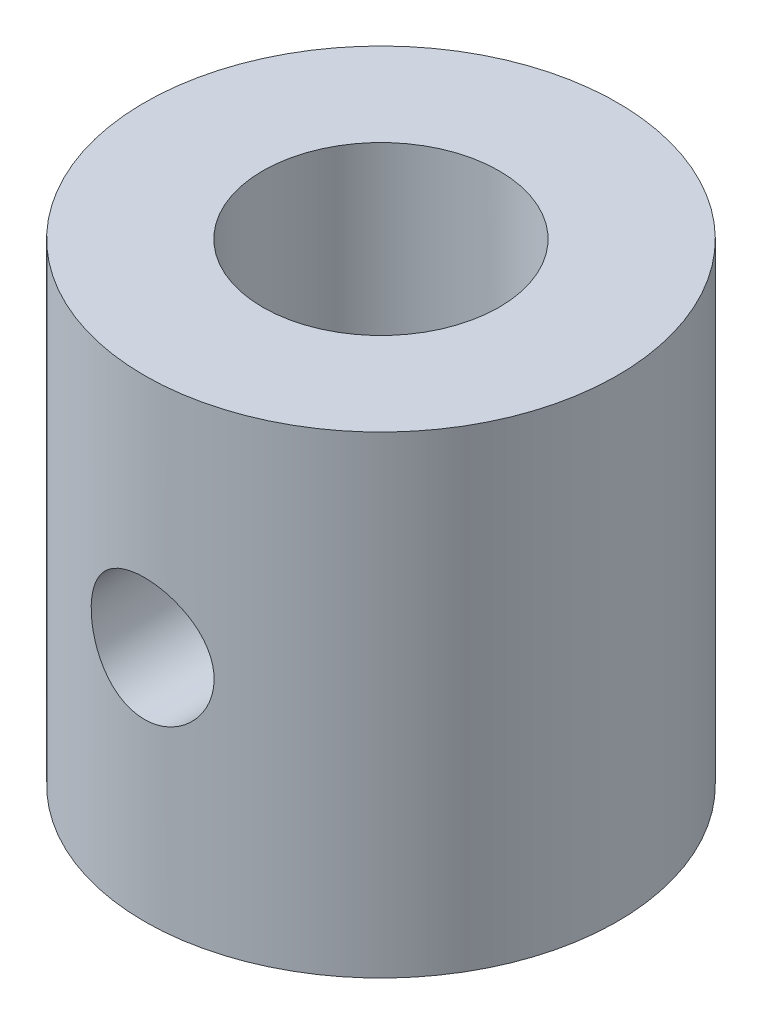
ISO-10303-21;
HEADER;
FILE_DESCRIPTION(('STEP AP214'),'2;1');
FILE_NAME('part.step','',(''),(''),'','','');
FILE_SCHEMA(('AUTOMOTIVE_DESIGN { 1 0 10303 214 1 1 1 1 }'));
ENDSEC;
DATA;
#1=APPLICATION_CONTEXT('core data for automotive mechanical design processes');
#2=APPLICATION_PROTOCOL_DEFINITION('international standard','automotive_design',2000,#1);
#3=PRODUCT_CONTEXT('',#1,'mechanical');
#4=PRODUCT('Part','Part','',(#3));
#5=PRODUCT_RELATED_PRODUCT_CATEGORY('part','',(#4));
#6=PRODUCT_DEFINITION_FORMATION('','',#4);
#7=PRODUCT_DEFINITION_CONTEXT('part definition',#1,'design');
#8=PRODUCT_DEFINITION('design','',#6,#7);
#9=PRODUCT_DEFINITION_SHAPE('','',#8);
#10=(LENGTH_UNIT() NAMED_UNIT(*) SI_UNIT(.MILLI.,.METRE.));
#11=(NAMED_UNIT(*) PLANE_ANGLE_UNIT() SI_UNIT($,.RADIAN.));
#12=(NAMED_UNIT(*) SI_UNIT($,.STERADIAN.) SOLID_ANGLE_UNIT());
#13=UNCERTAINTY_MEASURE_WITH_UNIT(LENGTH_MEASURE(1.E-05),#10,'distance_accuracy_value','');
#14=(GEOMETRIC_REPRESENTATION_CONTEXT(3) GLOBAL_UNCERTAINTY_ASSIGNED_CONTEXT((#13)) GLOBAL_UNIT_ASSIGNED_CONTEXT((#10,
#11,#12)) REPRESENTATION_CONTEXT('',''));
#15=CARTESIAN_POINT('',(0.,0.,0.));
#16=DIRECTION('',(0.,0.,1.));
#17=DIRECTION('',(1.,0.,0.));
#18=AXIS2_PLACEMENT_3D('',#15,#16,#17);
#19=CARTESIAN_POINT('',(0.,10.,0.));
#20=DIRECTION('',(0.,1.,0.));
#21=DIRECTION('',(0.,0.,1.));
#22=AXIS2_PLACEMENT_3D('',#19,#20,#21);
#23=PLANE('',#22);
#24=CARTESIAN_POINT('',(0.,10.,0.));
#25=DIRECTION('',(0.,1.,0.));
#26=DIRECTION('',(0.,0.,1.));
#27=AXIS2_PLACEMENT_3D('',#24,#25,#26);
#28=CIRCLE('',#27,5.);
#29=CARTESIAN_POINT('',(0.,10.,5.));
#30=VERTEX_POINT('',#29);
#31=EDGE_CURVE('E49',#30,#30,#28,.T.);
#32=ORIENTED_EDGE('',*,*,#31,.T.);
#33=EDGE_LOOP('',(#32));
#34=FACE_BOUND('',#33,.T.);
#35=CARTESIAN_POINT('',(0.,10.,0.));
#36=DIRECTION('',(0.,1.,0.));
#37=DIRECTION('',(0.,0.,1.));
#38=AXIS2_PLACEMENT_3D('',#35,#36,#37);
#39=CIRCLE('',#38,2.5);
#40=CARTESIAN_POINT('',(0.,10.,2.5));
#41=VERTEX_POINT('',#40);
#42=EDGE_CURVE('E85',#41,#41,#39,.T.);
#43=ORIENTED_EDGE('',*,*,#42,.F.);
#44=EDGE_LOOP('',(#43));
#45=FACE_BOUND('',#44,.T.);
#46=ADVANCED_FACE('F33',(#34,#45),#23,.T.);
#47=CARTESIAN_POINT('',(0.,0.,0.));
#48=DIRECTION('',(0.,1.,0.));
#49=DIRECTION('',(0.,0.,1.));
#50=AXIS2_PLACEMENT_3D('',#47,#48,#49);
#51=PLANE('',#50);
#52=CARTESIAN_POINT('',(0.,0.,0.));
#53=DIRECTION('',(0.,1.,0.));
#54=DIRECTION('',(0.,0.,1.));
#55=AXIS2_PLACEMENT_3D('',#52,#53,#54);
#56=CIRCLE('',#55,5.);
#57=CARTESIAN_POINT('',(0.,0.,5.));
#58=VERTEX_POINT('',#57);
#59=EDGE_CURVE('E53',#58,#58,#56,.T.);
#60=ORIENTED_EDGE('',*,*,#59,.F.);
#61=EDGE_LOOP('',(#60));
#62=FACE_BOUND('',#61,.T.);
#63=CARTESIAN_POINT('',(0.,0.,0.));
#64=DIRECTION('',(0.,1.,0.));
#65=DIRECTION('',(0.,0.,1.));
#66=AXIS2_PLACEMENT_3D('',#63,#64,#65);
#67=CIRCLE('',#66,2.5);
#68=CARTESIAN_POINT('',(0.,0.,2.5));
#69=VERTEX_POINT('',#68);
#70=EDGE_CURVE('E84',#69,#69,#67,.T.);
#71=ORIENTED_EDGE('',*,*,#70,.T.);
#72=EDGE_LOOP('',(#71));
#73=FACE_BOUND('',#72,.T.);
#74=ADVANCED_FACE('F91',(#62,#73),#51,.F.);
#75=CARTESIAN_POINT('',(0.,10.,0.));
#76=DIRECTION('',(0.,-1.,0.));
#77=DIRECTION('',(0.,0.,-1.));
#78=AXIS2_PLACEMENT_3D('',#75,#76,#77);
#79=CYLINDRICAL_SURFACE('',#78,5.);
#80=CARTESIAN_POINT('',(0.,6.3,-5.));
#81=CARTESIAN_POINT('',(-0.0717307786716104,6.29999816586154,-4.99999885912454));
#82=CARTESIAN_POINT('',(-0.14348153894728,6.29404317706765,-4.998441140995));
#83=CARTESIAN_POINT('',(-0.284920413497906,6.2704200751648,-4.99237823364743));
#84=CARTESIAN_POINT('',(-0.354607444099346,6.25274591833175,-4.98787152361252));
#85=CARTESIAN_POINT('',(-0.489856453463625,6.20629469406177,-4.97640871761101));
#86=CARTESIAN_POINT('',(-0.555423483742324,6.1775315444106,-4.96945569296409));
#87=CARTESIAN_POINT('',(-0.68080247992251,6.10976934681149,-4.95383737776702));
#88=CARTESIAN_POINT('',(-0.740614138181473,6.07076975210864,-4.94517199576156));
#89=CARTESIAN_POINT('',(-0.854108529262041,5.98273009067953,-4.92685216626645));
#90=CARTESIAN_POINT('',(-0.907645708599976,5.93350576070611,-4.91718147538334));
#91=CARTESIAN_POINT('',(-1.0058054182008,5.82680807084766,-4.89804673326225));
#92=CARTESIAN_POINT('',(-1.05042685981889,5.76933370507305,-4.88858270738436));
#93=CARTESIAN_POINT('',(-1.13018788316099,5.64661851125556,-4.87076767855598));
#94=CARTESIAN_POINT('',(-1.16516190324781,5.58126681773134,-4.86243722215411));
#95=CARTESIAN_POINT('',(-1.22356960439173,5.44535959205325,-4.84807058079245));
#96=CARTESIAN_POINT('',(-1.24700529718818,5.37480496951268,-4.84203399593172));
#97=CARTESIAN_POINT('',(-1.281169228899,5.23210205052739,-4.83310598130334));
#98=CARTESIAN_POINT('',(-1.29216048290362,5.16002088452016,-4.83014956376373));
#99=CARTESIAN_POINT('',(-1.3019432296733,5.01498176997082,-4.82752230668979));
#100=CARTESIAN_POINT('',(-1.30073688084738,4.94202397883275,-4.82785088586354));
#101=CARTESIAN_POINT('',(-1.2863678960504,4.79934028716682,-4.83169822957429));
#102=CARTESIAN_POINT('',(-1.2735215273875,4.72957990208878,-4.83513260277125));
#103=CARTESIAN_POINT('',(-1.23674288104121,4.59324021046968,-4.84466969943908));
#104=CARTESIAN_POINT('',(-1.21280975642707,4.52666114738238,-4.85077262676204));
#105=CARTESIAN_POINT('',(-1.15427447680391,4.39774002853323,-4.86503471141451));
#106=CARTESIAN_POINT('',(-1.11955986166448,4.33545151285766,-4.87321536914182));
#107=CARTESIAN_POINT('',(-1.04052555441476,4.21747178012729,-4.89069936804917));
#108=CARTESIAN_POINT('',(-0.996204056417374,4.16178180650457,-4.90000292016326));
#109=CARTESIAN_POINT('',(-0.897588399354157,4.0567707801978,-4.9190373655284));
#110=CARTESIAN_POINT('',(-0.843028117151477,4.00770008928812,-4.92877257463288));
#111=CARTESIAN_POINT('',(-0.726334791666221,3.91935513083208,-4.947314710364));
#112=CARTESIAN_POINT('',(-0.664201478488646,3.88008121258463,-4.95612160388557));
#113=CARTESIAN_POINT('',(-0.533750553018984,3.81234191921762,-4.97186464472852));
#114=CARTESIAN_POINT('',(-0.465409427094991,3.78391995820683,-4.978793246417));
#115=CARTESIAN_POINT('',(-0.324698261892371,3.73903950096387,-4.98994437896931));
#116=CARTESIAN_POINT('',(-0.252329061519939,3.72257852364206,-4.99416747102063));
#117=CARTESIAN_POINT('',(-0.107754265628856,3.70247601810568,-4.99934762845146));
#118=CARTESIAN_POINT('',(-0.0355990679618566,3.69849388039378,-5.00039144909205));
#119=CARTESIAN_POINT('',(0.108347558385988,3.70252407708697,-4.9993439302767));
#120=CARTESIAN_POINT('',(0.180139021986154,3.71053523734338,-4.99725289772412));
#121=CARTESIAN_POINT('',(0.320117661841459,3.73804465756627,-4.9902264842307));
#122=CARTESIAN_POINT('',(0.3883443967086,3.75735463113079,-4.98533775354441));
#123=CARTESIAN_POINT('',(0.520584855265785,3.80669635149957,-4.97326895706077));
#124=CARTESIAN_POINT('',(0.584598133561371,3.83672922964772,-4.96608864949399));
#125=CARTESIAN_POINT('',(0.707930992016775,3.90730750951055,-4.95002802767655));
#126=CARTESIAN_POINT('',(0.767139321552232,3.94804043928579,-4.94111821378144));
#127=CARTESIAN_POINT('',(0.878000441471827,4.03862522166252,-4.92262930746647));
#128=CARTESIAN_POINT('',(0.929651812778711,4.08847878302904,-4.91305008984093));
#129=CARTESIAN_POINT('',(1.02535533145664,4.19747610283433,-4.89398559724572));
#130=CARTESIAN_POINT('',(1.0691676974822,4.25683240802754,-4.88450966299983));
#131=CARTESIAN_POINT('',(1.14621298401497,4.38225303325104,-4.86700757475785));
#132=CARTESIAN_POINT('',(1.1794463607291,4.44831706385618,-4.85898135825078));
#133=CARTESIAN_POINT('',(1.23414034237999,4.58493610486184,-4.84537844502717));
#134=CARTESIAN_POINT('',(1.25567007103908,4.65546193804776,-4.83978740561989));
#135=CARTESIAN_POINT('',(1.28651743722663,4.79930171484937,-4.83168004742566));
#136=CARTESIAN_POINT('',(1.29583800946139,4.87261498408958,-4.82916298975775));
#137=CARTESIAN_POINT('',(1.30183988013393,5.01749983369733,-4.82754813134566));
#138=CARTESIAN_POINT('',(1.29890566929442,5.08905457201614,-4.82834631145179));
#139=CARTESIAN_POINT('',(1.28136829919157,5.2306112653395,-4.83302969132189));
#140=CARTESIAN_POINT('',(1.26676541261453,5.30061325659105,-4.83691481894669));
#141=CARTESIAN_POINT('',(1.22652296626336,5.43662027692297,-4.84727400349191));
#142=CARTESIAN_POINT('',(1.20096107281371,5.5026497724797,-4.85372981947422));
#143=CARTESIAN_POINT('',(1.13958690119683,5.62953183040472,-4.86850424398437));
#144=CARTESIAN_POINT('',(1.10377308914157,5.6903836163174,-4.87682313122364));
#145=CARTESIAN_POINT('',(1.02173013022611,5.8070274672692,-4.89467814244602));
#146=CARTESIAN_POINT('',(0.97523679892822,5.86262951434169,-4.9042418835856));
#147=CARTESIAN_POINT('',(0.87366206477925,5.96536747478793,-4.92335054739323));
#148=CARTESIAN_POINT('',(0.818578597936101,6.01250134760105,-4.93289546497886));
#149=CARTESIAN_POINT('',(0.700055598942871,6.09789014611913,-4.95111947868785));
#150=CARTESIAN_POINT('',(0.636470787048337,6.13594830359197,-4.9597774014975));
#151=CARTESIAN_POINT('',(0.50358410149903,6.20077479935966,-4.97502379799896));
#152=CARTESIAN_POINT('',(0.434286110017086,6.22755072968078,-4.9816136625622));
#153=CARTESIAN_POINT('',(0.304324490623244,6.26536273677146,-4.99107925028337));
#154=CARTESIAN_POINT('',(0.244245830872914,6.27832240703174,-4.99440072931575));
#155=CARTESIAN_POINT('',(0.122782916586036,6.29564144249486,-4.99886149574191));
#156=CARTESIAN_POINT('',(0.0613987782532482,6.30000156995174,-5.00000097654536));
#157=CARTESIAN_POINT('',(0.,6.3,-5.));
#158=B_SPLINE_CURVE_WITH_KNOTS('',3,(#80,#81,#82,#83,#84,#85,#86,#87,#88,#89,#90,#91,#92,#93,
#94,#95,#96,#97,#98,#99,#100,#101,#102,#103,#104,#105,#106,#107,#108,#109,#110,#111,#112,#113,
#114,#115,#116,#117,#118,#119,#120,#121,#122,#123,#124,#125,#126,#127,#128,#129,#130,#131,#132,
#133,#134,#135,#136,#137,#138,#139,#140,#141,#142,#143,#144,#145,#146,#147,#148,#149,#150,#151,
#152,#153,#154,#155,#156,#157),.UNSPECIFIED.,.T.,.F.,(4,2,2,2,2,2,2,2,2,2,2,2,2,2,2,2,2,2,2,2,2,
2,2,2,2,2,2,2,2,2,2,2,2,2,2,2,2,2,4),(0.,0.214967237033415,0.43004542172036,0.644854536178949,
0.859675126481417,1.07876816860036,1.29788794646979,1.52056237814132,1.74319797214783,
1.96103475933145,2.17883300019886,2.39088534386669,2.60295388914234,2.8173133212086,
3.03171308323144,3.25274629224052,3.47378738094936,3.69570372080879,3.91757401498792,
4.13333313105578,4.34907112560077,4.56131245775761,4.77357618952829,4.98984196043498,
5.20614829065226,5.42823125959202,5.65030465015768,5.87105177957784,6.09174583842406,
6.30556854774109,6.51938626036272,6.73171306829716,6.94407166110446,7.16239228611877,
7.38076544910421,7.60351288552391,7.82611019062644,8.01013016140658,8.19413382012542),.UNSPECIFIED.);
#159=CARTESIAN_POINT('',(0.,6.3,-5.));
#160=VERTEX_POINT('',#159);
#161=EDGE_CURVE('E10',#160,#160,#158,.T.);
#162=ORIENTED_EDGE('',*,*,#161,.T.);
#163=EDGE_LOOP('',(#162));
#164=FACE_BOUND('',#163,.T.);
#165=CARTESIAN_POINT('',(1.3,5.,4.82804308182932));
#166=CARTESIAN_POINT('',(1.29999814071176,4.92831543819353,4.82804438294673));
#167=CARTESIAN_POINT('',(1.29405055878907,4.85661084443446,4.82965703633706));
#168=CARTESIAN_POINT('',(1.27045953916153,4.71526772094445,4.83591526705558));
#169=CARTESIAN_POINT('',(1.25280985374835,4.6456303156384,4.84056246449516));
#170=CARTESIAN_POINT('',(1.20643013528902,4.51048658520935,4.85232867742722));
#171=CARTESIAN_POINT('',(1.17771516047257,4.44497478609409,4.85944433240521));
#172=CARTESIAN_POINT('',(1.11006663109088,4.31968943993345,4.87534146258583));
#173=CARTESIAN_POINT('',(1.07113242774976,4.25991625753791,4.88412304354127));
#174=CARTESIAN_POINT('',(0.983160787049072,4.14638311257075,4.9025965333159));
#175=CARTESIAN_POINT('',(0.933924358385022,4.09277982933261,4.91230394030119));
#176=CARTESIAN_POINT('',(0.827174138302681,3.9944912078773,4.93140126074018));
#177=CARTESIAN_POINT('',(0.76965952476481,3.94980675645658,4.94079114254542));
#178=CARTESIAN_POINT('',(0.646904444191931,3.86997589459211,4.9583677715965));
#179=CARTESIAN_POINT('',(0.581559990615817,3.83498449788117,4.96653410115342));
#180=CARTESIAN_POINT('',(0.445668225158111,3.77654272784076,4.98056608916578));
#181=CARTESIAN_POINT('',(0.375121747806653,3.75309050796047,4.98643211569552));
#182=CARTESIAN_POINT('',(0.232463096599407,3.71889776742967,4.99509297894462));
#183=CARTESIAN_POINT('',(0.160418728433336,3.70789090717153,4.99795206894796));
#184=CARTESIAN_POINT('',(0.0154531003528707,3.69806416253083,5.00050126649153));
#185=CARTESIAN_POINT('',(-0.0574680179168839,3.69924233531538,5.00019187922718));
#186=CARTESIAN_POINT('',(-0.20026604954253,3.71356302571352,4.99648636625984));
#187=CARTESIAN_POINT('',(-0.270174027946926,3.72641789731932,4.99316445484447));
#188=CARTESIAN_POINT('',(-0.406804325801316,3.76326333633406,4.9838942454672));
#189=CARTESIAN_POINT('',(-0.47352646805391,3.78725452235512,4.97794580160471));
#190=CARTESIAN_POINT('',(-0.602634963507835,3.84591699919819,4.96397941622098));
#191=CARTESIAN_POINT('',(-0.664973662956062,3.8806883915405,4.95594219714625));
#192=CARTESIAN_POINT('',(-0.783030487328476,3.95984779039856,4.93866663714116));
#193=CARTESIAN_POINT('',(-0.838747374530537,4.00423759038396,4.92942807233384));
#194=CARTESIAN_POINT('',(-0.943695381212287,4.1029068745289,4.9104347530293));
#195=CARTESIAN_POINT('',(-0.992689398894569,4.15743744694639,4.90067280347285));
#196=CARTESIAN_POINT('',(-1.08089314371402,4.27404241005206,4.88197793346539));
#197=CARTESIAN_POINT('',(-1.12010233345944,4.33611721479812,4.87304505856484));
#198=CARTESIAN_POINT('',(-1.18779210748277,4.46654264941231,4.85699211258632));
#199=CARTESIAN_POINT('',(-1.21621126282147,4.53492653676509,4.84988249375313));
#200=CARTESIAN_POINT('',(-1.2610735265125,4.67573191871052,4.83841251034588));
#201=CARTESIAN_POINT('',(-1.27751943723864,4.74815246423648,4.8340515024833));
#202=CARTESIAN_POINT('',(-1.29756590475638,4.89276552402976,4.82870874086795));
#203=CARTESIAN_POINT('',(-1.30151887902437,4.96490581733837,4.82763430392206));
#204=CARTESIAN_POINT('',(-1.29743573427148,5.10881608059619,4.82873328148061));
#205=CARTESIAN_POINT('',(-1.28940082017096,5.18058608703593,4.83090636957155));
#206=CARTESIAN_POINT('',(-1.26187999435491,5.32038079373405,4.83816630770043));
#207=CARTESIAN_POINT('',(-1.24260320473063,5.38844969559454,4.84319990379352));
#208=CARTESIAN_POINT('',(-1.19337962137627,5.52038894317616,4.85556226857613));
#209=CARTESIAN_POINT('',(-1.16343148592986,5.58425875974648,4.8628913258617));
#210=CARTESIAN_POINT('',(-1.09299086940367,5.7074689000758,4.87921104043398));
#211=CARTESIAN_POINT('',(-1.05228991050067,5.76668574081089,4.8882333961873));
#212=CARTESIAN_POINT('',(-0.961759519956489,5.87757849959682,4.90684725131463));
#213=CARTESIAN_POINT('',(-0.911928460286918,5.9292530697951,4.91643885198665));
#214=CARTESIAN_POINT('',(-0.802927457642495,6.02504294767372,4.93542752332724));
#215=CARTESIAN_POINT('',(-0.743539647922228,6.06891329051749,4.94481212896065));
#216=CARTESIAN_POINT('',(-0.618036999439785,6.14606053178623,4.9620596797932));
#217=CARTESIAN_POINT('',(-0.551922517385504,6.17933799155394,4.9699227056159));
#218=CARTESIAN_POINT('',(-0.41530676124558,6.23405543853372,4.98319077006388));
#219=CARTESIAN_POINT('',(-0.344842287213748,6.25558271455981,4.98861387964561));
#220=CARTESIAN_POINT('',(-0.201134819664027,6.28644580609914,4.99647044658465));
#221=CARTESIAN_POINT('',(-0.127892412625103,6.2957841803595,4.99890453140465));
#222=CARTESIAN_POINT('',(0.0169981653282687,6.30185070607764,5.00048079571631));
#223=CARTESIAN_POINT('',(0.0886304510901346,6.29893905729201,4.99971700870091));
#224=CARTESIAN_POINT('',(0.230348414653652,6.28141992611172,4.99519432073835));
#225=CARTESIAN_POINT('',(0.300434145402538,6.26681284475751,4.99143552249119));
#226=CARTESIAN_POINT('',(0.43665906629316,6.2265170125288,4.98136216530199));
#227=CARTESIAN_POINT('',(0.502820193629004,6.2008981258412,4.97506373435513));
#228=CARTESIAN_POINT('',(0.629942643035346,6.13936860176776,4.96057154267878));
#229=CARTESIAN_POINT('',(0.690903263203756,6.10345657798047,4.95237752665817));
#230=CARTESIAN_POINT('',(0.80758395880246,6.02128794622585,4.93471195701911));
#231=CARTESIAN_POINT('',(0.863130097729761,5.97479022781909,4.92521308618471));
#232=CARTESIAN_POINT('',(0.965753327538054,5.87323180056746,4.90612382290124));
#233=CARTESIAN_POINT('',(1.0128282208609,5.81816887667688,4.89653340738171));
#234=CARTESIAN_POINT('',(1.09813020007219,5.69967721251508,4.87812032233053));
#235=CARTESIAN_POINT('',(1.13615490974272,5.63609942681561,4.8693175526745));
#236=CARTESIAN_POINT('',(1.20092064597112,5.50323277055425,4.85375181162252));
#237=CARTESIAN_POINT('',(1.22766939505212,5.43394784761835,4.84698744510167));
#238=CARTESIAN_POINT('',(1.26542522449605,5.30405187769319,4.83725203116222));
#239=CARTESIAN_POINT('',(1.27836122683162,5.24402856715327,4.83382580755705));
#240=CARTESIAN_POINT('',(1.29564897409146,5.12267497210455,4.82922089033318));
#241=CARTESIAN_POINT('',(1.30000159110555,5.06134482101356,4.82804196838435));
#242=CARTESIAN_POINT('',(1.3,5.,4.82804308182932));
#243=B_SPLINE_CURVE_WITH_KNOTS('',3,(#165,#166,#167,#168,#169,#170,#171,#172,#173,#174,#175,
#176,#177,#178,#179,#180,#181,#182,#183,#184,#185,#186,#187,#188,#189,#190,#191,#192,#193,#194,
#195,#196,#197,#198,#199,#200,#201,#202,#203,#204,#205,#206,#207,#208,#209,#210,#211,#212,#213,
#214,#215,#216,#217,#218,#219,#220,#221,#222,#223,#224,#225,#226,#227,#228,#229,#230,#231,#232,
#233,#234,#235,#236,#237,#238,#239,#240,#241,#242),.UNSPECIFIED.,.T.,.F.,(4,2,2,2,2,2,2,2,2,2,2,
2,2,2,2,2,2,2,2,2,2,2,2,2,2,2,2,2,2,2,2,2,2,2,2,2,2,2,4),(0.,0.214828234146462,
0.429771256724355,0.64442280062493,0.859087975147308,1.07836257149293,1.29765895938899,
1.52028284784706,1.74287109943657,1.96059988111388,2.17829394773421,2.3907665602754,
2.60325097688922,2.81777074350615,3.0323305444295,3.253160137729,3.47400185652499,
3.6960826450123,3.91811143810026,4.13381831947844,4.34950352129991,4.56129902598918,
4.77312116928793,4.98939736474058,5.20571216295111,5.42793411443678,5.65014428787732,
5.87068044429091,6.09117029734818,6.30522287884536,6.51926812071938,6.73197494966035,
6.94471044194736,7.16288757110522,7.38112121709,7.60385320075513,7.82643239403149,
8.01029260630719,8.19413413703944),.UNSPECIFIED.);
#244=CARTESIAN_POINT('',(1.3,5.,4.82804308182932));
#245=VERTEX_POINT('',#244);
#246=EDGE_CURVE('E45',#245,#245,#243,.T.);
#247=ORIENTED_EDGE('',*,*,#246,.T.);
#248=EDGE_LOOP('',(#247));
#249=FACE_BOUND('',#248,.T.);
#250=ORIENTED_EDGE('',*,*,#31,.F.);
#251=EDGE_LOOP('',(#250));
#252=FACE_BOUND('',#251,.T.);
#253=ORIENTED_EDGE('',*,*,#59,.T.);
#254=EDGE_LOOP('',(#253));
#255=FACE_BOUND('',#254,.T.);
#256=ADVANCED_FACE('F35',(#164,#249,#252,#255),#79,.T.);
#257=CARTESIAN_POINT('',(0.,10.,0.));
#258=DIRECTION('',(0.,-1.,0.));
#259=DIRECTION('',(0.,0.,-1.));
#260=AXIS2_PLACEMENT_3D('',#257,#258,#259);
#261=CYLINDRICAL_SURFACE('',#260,2.5);
#262=CARTESIAN_POINT('',(0.,6.3,-2.5));
#263=CARTESIAN_POINT('',(-0.0680113695059637,6.29999558097969,-2.49999609902581));
#264=CARTESIAN_POINT('',(-0.136093788180357,6.29463162297654,-2.49719546987896));
#265=CARTESIAN_POINT('',(-0.27022545425075,6.27342303388201,-2.48626765671663));
#266=CARTESIAN_POINT('',(-0.336271062711261,6.25756066682732,-2.47813145902996));
#267=CARTESIAN_POINT('',(-0.464188472425049,6.21615407054804,-2.45737911115534));
#268=CARTESIAN_POINT('',(-0.526075766477189,6.19064843084437,-2.44478082944565));
#269=CARTESIAN_POINT('',(-0.644589209675043,6.13089060896187,-2.41624205813435));
#270=CARTESIAN_POINT('',(-0.701215505423525,6.0966386706068,-2.40030166170432));
#271=CARTESIAN_POINT('',(-0.811667592126633,6.01788312810977,-2.36532501176449));
#272=CARTESIAN_POINT('',(-0.865083381438268,5.97286439852768,-2.34615603866432));
#273=CARTESIAN_POINT('',(-0.9639890569701,5.87497055716437,-2.30728290736441));
#274=CARTESIAN_POINT('',(-1.00947237054757,5.82208899701741,-2.28757832084618));
#275=CARTESIAN_POINT('',(-1.09513753441025,5.70455845520348,-2.24790755636024));
#276=CARTESIAN_POINT('',(-1.13453247326665,5.63928969900799,-2.22806332919204));
#277=CARTESIAN_POINT('',(-1.20162263947399,5.5019286437702,-2.19261300871779));
#278=CARTESIAN_POINT('',(-1.22932667033737,5.4298415293584,-2.1770037295764));
#279=CARTESIAN_POINT('',(-1.27036888654655,5.28538261934588,-2.15329918557366));
#280=CARTESIAN_POINT('',(-1.28448748494984,5.21330240270994,-2.1447999806986));
#281=CARTESIAN_POINT('',(-1.30032214599434,5.06733829912883,-2.13524197560195));
#282=CARTESIAN_POINT('',(-1.30205239339102,4.99345657226103,-2.13417466584282));
#283=CARTESIAN_POINT('',(-1.29363159633312,4.85649275191733,-2.13928164525274));
#284=CARTESIAN_POINT('',(-1.28501836836426,4.79327214308005,-2.14451886326309));
#285=CARTESIAN_POINT('',(-1.25884150775024,4.66934816643952,-2.15998772155474));
#286=CARTESIAN_POINT('',(-1.24127460315842,4.60864572762776,-2.17022118755991));
#287=CARTESIAN_POINT('',(-1.19739608727306,4.48975152758059,-2.19473990584834));
#288=CARTESIAN_POINT('',(-1.17089309730273,4.43164931861785,-2.20911272964634));
#289=CARTESIAN_POINT('',(-1.11004732855925,4.32042809671486,-2.24030417293868));
#290=CARTESIAN_POINT('',(-1.07570103709793,4.26731133163273,-2.2571238870646));
#291=CARTESIAN_POINT('',(-0.994600690710107,4.15981655563225,-2.29412683800401));
#292=CARTESIAN_POINT('',(-0.946786597955374,4.10628463283547,-2.31445310227271));
#293=CARTESIAN_POINT('',(-0.842817041578252,4.00762978696943,-2.35430677787375));
#294=CARTESIAN_POINT('',(-0.786656980792264,3.96251152943353,-2.3738337413228));
#295=CARTESIAN_POINT('',(-0.663774127410603,3.87965060642806,-2.41116994987061));
#296=CARTESIAN_POINT('',(-0.596644646812708,3.84243795998662,-2.42882944374779));
#297=CARTESIAN_POINT('',(-0.455930966123096,3.78015071661923,-2.45912356419007));
#298=CARTESIAN_POINT('',(-0.382352338507075,3.75506576037823,-2.47176247761752));
#299=CARTESIAN_POINT('',(-0.237696689390577,3.71994217073909,-2.48964687281174));
#300=CARTESIAN_POINT('',(-0.166960386836867,3.70878288196254,-2.49544064536842));
#301=CARTESIAN_POINT('',(-0.0243942042796442,3.69826832792079,-2.50089635599645));
#302=CARTESIAN_POINT('',(0.0474350713497834,3.69890676014066,-2.50056156803526));
#303=CARTESIAN_POINT('',(0.183618209438065,3.71137313423458,-2.49410050655221));
#304=CARTESIAN_POINT('',(0.248087136366192,3.72224207915055,-2.48847062394008));
#305=CARTESIAN_POINT('',(0.374141031441013,3.75331102944845,-2.47266151578169));
#306=CARTESIAN_POINT('',(0.435725691885607,3.77351202791538,-2.46248180606224));
#307=CARTESIAN_POINT('',(0.55618110520896,3.82313115942011,-2.43814302074764));
#308=CARTESIAN_POINT('',(0.614936096743494,3.85278017014388,-2.4238852987495));
#309=CARTESIAN_POINT('',(0.726817602279269,3.92018210792856,-2.39272108080907));
#310=CARTESIAN_POINT('',(0.779941812395783,3.95793833315711,-2.37581350761577));
#311=CARTESIAN_POINT('',(0.884925243858758,4.04499803288043,-2.33887075877338));
#312=CARTESIAN_POINT('',(0.936078033693248,4.09509413429452,-2.31869319367569));
#313=CARTESIAN_POINT('',(1.02959738484077,4.20310677159968,-2.27871043976582));
#314=CARTESIAN_POINT('',(1.07195663837658,4.26102974646841,-2.25890557300989));
#315=CARTESIAN_POINT('',(1.14910272035529,4.38733673410915,-2.22070397734203));
#316=CARTESIAN_POINT('',(1.18328973831135,4.45613791542058,-2.20246093456135));
#317=CARTESIAN_POINT('',(1.23924098239168,4.59975141512398,-2.17147835100918));
#318=CARTESIAN_POINT('',(1.26102233570193,4.67455528255512,-2.15873122854439));
#319=CARTESIAN_POINT('',(1.28943999012578,4.82027124591388,-2.14186687422014));
#320=CARTESIAN_POINT('',(1.29734839119879,4.89084921061157,-2.13702798664101));
#321=CARTESIAN_POINT('',(1.3015203399281,5.0324609798733,-2.13449180299612));
#322=CARTESIAN_POINT('',(1.29779049988741,5.10349450272353,-2.13679045171325));
#323=CARTESIAN_POINT('',(1.2800034542772,5.23567610593051,-2.14748109373078));
#324=CARTESIAN_POINT('',(1.26713384169057,5.29704873313191,-2.15517118633996));
#325=CARTESIAN_POINT('',(1.23298733247355,5.41666977993838,-2.17488587021125));
#326=CARTESIAN_POINT('',(1.21170751826453,5.4749171073746,-2.18691196554666));
#327=CARTESIAN_POINT('',(1.15979270017153,5.59091755995026,-2.21490467413759));
#328=CARTESIAN_POINT('',(1.12863261878603,5.64838392984563,-2.23107909446047));
#329=CARTESIAN_POINT('',(1.05838667201274,5.7576554103908,-2.2652468080127));
#330=CARTESIAN_POINT('',(1.01929655715554,5.80945746269853,-2.28324107383964));
#331=CARTESIAN_POINT('',(0.928121386241815,5.91322632204944,-2.32193011926889));
#332=CARTESIAN_POINT('',(0.874994006967038,5.96426887192055,-2.34266114669507));
#333=CARTESIAN_POINT('',(0.760430106723441,6.05696539628012,-2.38231377154673));
#334=CARTESIAN_POINT('',(0.698988646857174,6.09861375071996,-2.40123428195996));
#335=CARTESIAN_POINT('',(0.56798635034822,6.17179940036645,-2.43558032718761));
#336=CARTESIAN_POINT('',(0.498306712219097,6.20315557424179,-2.45094198545967));
#337=CARTESIAN_POINT('',(0.353697863564513,6.25328257101944,-2.47593211426922));
#338=CARTESIAN_POINT('',(0.27878369311859,6.27208793572085,-2.48557631190442));
#339=CARTESIAN_POINT('',(0.169188039913601,6.28939079306565,-2.49449662438316));
#340=CARTESIAN_POINT('',(0.135513064047053,6.29336255907375,-2.49655400233432));
#341=CARTESIAN_POINT('',(0.0678979669149635,6.29866829577143,-2.49930667952064));
#342=CARTESIAN_POINT('',(0.0339578396300287,6.30000220640143,-2.50000194774281));
#343=CARTESIAN_POINT('',(0.,6.3,-2.5));
#344=B_SPLINE_CURVE_WITH_KNOTS('',3,(#262,#263,#264,#265,#266,#267,#268,#269,#270,#271,#272,
#273,#274,#275,#276,#277,#278,#279,#280,#281,#282,#283,#284,#285,#286,#287,#288,#289,#290,#291,
#292,#293,#294,#295,#296,#297,#298,#299,#300,#301,#302,#303,#304,#305,#306,#307,#308,#309,#310,
#311,#312,#313,#314,#315,#316,#317,#318,#319,#320,#321,#322,#323,#324,#325,#326,#327,#328,#329,
#330,#331,#332,#333,#334,#335,#336,#337,#338,#339,#340,#341,#342,#343),.UNSPECIFIED.,.T.,.F.,(4,
2,2,2,2,2,2,2,2,2,2,2,2,2,2,2,2,2,2,2,2,2,2,2,2,2,2,2,2,2,2,2,2,2,2,2,2,2,2,2,4),(0.,
0.203896806366286,0.408138957322479,0.611572296877393,0.81499996586563,1.03142326439272,
1.24802504237353,1.48316517792176,1.71812793040787,1.93860407014476,2.15882772260558,
2.34998891208855,2.54122000784163,2.73683841649128,2.93254460690001,3.1553833185219,
3.37834523326737,3.6133502261928,3.84815412468368,4.06249724663537,4.2767258666712,
4.47268293759258,4.66866086639623,4.86985169558172,5.07112452858475,5.29333433206541,
5.51572806791229,5.75134168970874,5.98662923131484,6.19892188281193,6.41109394154321,
6.59980430594202,6.78858019329845,6.98982480284758,7.19117753962888,7.41974793265732,
7.64845470667188,7.88099383218267,8.11289030496962,8.21469295152373,8.31649791592831),.UNSPECIFIED.);
#345=CARTESIAN_POINT('',(0.,6.3,-2.5));
#346=VERTEX_POINT('',#345);
#347=EDGE_CURVE('E78',#346,#346,#344,.T.);
#348=ORIENTED_EDGE('',*,*,#347,.F.);
#349=EDGE_LOOP('',(#348));
#350=FACE_BOUND('',#349,.T.);
#351=CARTESIAN_POINT('',(1.3,5.,2.13541565040626));
#352=CARTESIAN_POINT('',(1.29999499202181,4.93269100075459,2.13542218510378));
#353=CARTESIAN_POINT('',(1.29473701672372,4.86530685608975,2.13864723650627));
#354=CARTESIAN_POINT('',(1.2739892797997,4.73264180439464,2.15106664383973));
#355=CARTESIAN_POINT('',(1.2584797543963,4.66736521594842,2.1602725295249));
#356=CARTESIAN_POINT('',(1.21810181079737,4.54108954043734,2.18329096498212));
#357=CARTESIAN_POINT('',(1.19328638783914,4.48006850959343,2.19707737979651));
#358=CARTESIAN_POINT('',(1.13516352123659,4.36307323514826,2.22766227770051));
#359=CARTESIAN_POINT('',(1.10185505167652,4.30709960235286,2.24446112460342));
#360=CARTESIAN_POINT('',(1.02419532044111,4.19625635015196,2.2810137465525));
#361=CARTESIAN_POINT('',(0.979121896827738,4.14193530864805,2.30089741785951));
#362=CARTESIAN_POINT('',(0.880709450271073,4.04119172852187,2.34033381565221));
#363=CARTESIAN_POINT('',(0.827366033575872,3.99477341619444,2.35988636005305));
#364=CARTESIAN_POINT('',(0.709085538887552,3.90776535204113,2.39819471975978));
#365=CARTESIAN_POINT('',(0.64358122903566,3.86786597293379,2.41678309039593));
#366=CARTESIAN_POINT('',(0.505641388544541,3.7999060385296,2.44935371352648));
#367=CARTESIAN_POINT('',(0.433210624601341,3.77183741237836,2.46333910470838));
#368=CARTESIAN_POINT('',(0.289298945506806,3.73056076602125,2.48418681583152));
#369=CARTESIAN_POINT('',(0.21816346015473,3.71638624591815,2.49150934080119));
#370=CARTESIAN_POINT('',(0.0741778008891674,3.70010130033559,2.49993700304784));
#371=CARTESIAN_POINT('',(0.00132879562041781,3.69798287901472,2.50104626107773));
#372=CARTESIAN_POINT('',(-0.136682456405424,3.70553406154927,2.49712573383651));
#373=CARTESIAN_POINT('',(-0.201924315538508,3.7141157349075,2.49266247499283));
#374=CARTESIAN_POINT('',(-0.329885993888209,3.74085424661549,2.47897486045309));
#375=CARTESIAN_POINT('',(-0.392605622438355,3.75901180738965,2.46975014554423));
#376=CARTESIAN_POINT('',(-0.514777576681895,3.80446269517812,2.44722620871872));
#377=CARTESIAN_POINT('',(-0.574177681565647,3.83187020447115,2.43387624736632));
#378=CARTESIAN_POINT('',(-0.687669921056002,3.89486328437445,2.40427842476177));
#379=CARTESIAN_POINT('',(-0.741760209420257,3.93045168523819,2.3880295610447));
#380=CARTESIAN_POINT('',(-0.848875674255686,4.01287163365255,2.35221370900834));
#381=CARTESIAN_POINT('',(-0.901253228298809,4.0604716841809,2.33247739567263));
#382=CARTESIAN_POINT('',(-0.997646191492153,4.16352690745745,2.29290702169619));
#383=CARTESIAN_POINT('',(-1.04165426010071,4.21898890188274,2.27307289076015));
#384=CARTESIAN_POINT('',(-1.12321984532313,4.34109920091927,2.23395831464773));
#385=CARTESIAN_POINT('',(-1.16007544362624,4.4082677068647,2.21482304995731));
#386=CARTESIAN_POINT('',(-1.22169363677283,4.54905493191469,2.18144537006633));
#387=CARTESIAN_POINT('',(-1.24646958145131,4.62266642390193,2.16719755868201));
#388=CARTESIAN_POINT('',(-1.28113869349278,4.76804179066203,2.14687223354657));
#389=CARTESIAN_POINT('',(-1.29207210047855,4.83947486439331,2.14022786744823));
#390=CARTESIAN_POINT('',(-1.30189057145277,4.98344415250228,2.13427299745983));
#391=CARTESIAN_POINT('',(-1.30078590562577,5.05597937383367,2.13495624207002));
#392=CARTESIAN_POINT('',(-1.28751419422177,5.19055259096551,2.14297632381999));
#393=CARTESIAN_POINT('',(-1.27672416536977,5.25278459890024,2.14948465404406));
#394=CARTESIAN_POINT('',(-1.24649206812443,5.37441540132131,2.16715522437386));
#395=CARTESIAN_POINT('',(-1.22704687428944,5.4338131637549,2.17831914555465));
#396=CARTESIAN_POINT('',(-1.17915135897732,5.55118341919702,2.2046263385068));
#397=CARTESIAN_POINT('',(-1.15033209571267,5.60896859894892,2.21992733944489));
#398=CARTESIAN_POINT('',(-1.08481983617793,5.71922410010058,2.25266652106441));
#399=CARTESIAN_POINT('',(-1.04812279157547,5.7716916683347,2.27010579860658));
#400=CARTESIAN_POINT('',(-0.961968585041585,5.87743243108226,2.3080563653285));
#401=CARTESIAN_POINT('',(-0.911448064320808,5.92981068251795,2.32865859376251));
#402=CARTESIAN_POINT('',(-0.802069969538998,6.0256575346832,2.3685593010825));
#403=CARTESIAN_POINT('',(-0.743208834810629,6.06912231069187,2.38785721792472));
#404=CARTESIAN_POINT('',(-0.616079757666165,6.14725779197344,2.42383055698205));
#405=CARTESIAN_POINT('',(-0.547554418399365,6.18156687006771,2.44039035375406));
#406=CARTESIAN_POINT('',(-0.404596041904183,6.23781518464332,2.46811344440668));
#407=CARTESIAN_POINT('',(-0.3301686692178,6.25976612191498,2.47928184147595));
#408=CARTESIAN_POINT('',(-0.185242302436261,6.28864646197408,2.49408770335634));
#409=CARTESIAN_POINT('',(-0.115054090191301,6.29681769736253,2.49834623904765));
#410=CARTESIAN_POINT('',(0.0258139751293491,6.30165035259279,2.50085731835905));
#411=CARTESIAN_POINT('',(0.0964936134403558,6.29831651925919,2.49911233894338));
#412=CARTESIAN_POINT('',(0.230745025430367,6.2810131453441,2.4901702321934));
#413=CARTESIAN_POINT('',(0.294452891678613,6.26785819481425,2.48339088692572));
#414=CARTESIAN_POINT('',(0.418632589796487,6.23244360629637,2.46549879631304));
#415=CARTESIAN_POINT('',(0.479103990198096,6.21018275776165,2.45438547481431));
#416=CARTESIAN_POINT('',(0.597836427433065,6.1562926942939,2.42825778950366));
#417=CARTESIAN_POINT('',(0.655911969712632,6.12432401154589,2.41310502617537));
#418=CARTESIAN_POINT('',(0.766098965877375,6.05234429189012,2.38042028457294));
#419=CARTESIAN_POINT('',(0.818207739555165,6.0123296628999,2.36288724477302));
#420=CARTESIAN_POINT('',(0.920833636857414,5.92048781231075,2.3249443700486));
#421=CARTESIAN_POINT('',(0.970593729651149,5.86785731959157,2.30442678436291));
#422=CARTESIAN_POINT('',(1.06089570237737,5.75481045056703,2.2642766092094));
#423=CARTESIAN_POINT('',(1.10142823987707,5.69438627963718,2.24464493265648));
#424=CARTESIAN_POINT('',(1.1737478150068,5.56401926350598,2.20772266788278));
#425=CARTESIAN_POINT('',(1.20506480327902,5.49377228794215,2.19057533563931));
#426=CARTESIAN_POINT('',(1.25494868861382,5.34785344104444,2.16239301738629));
#427=CARTESIAN_POINT('',(1.27355781297327,5.27220046844513,2.15133781156506));
#428=CARTESIAN_POINT('',(1.29015276550731,5.16301900717154,2.14138529642277));
#429=CARTESIAN_POINT('',(1.29383860106908,5.13057245861674,2.13915633942569));
#430=CARTESIAN_POINT('',(1.29876350890652,5.06542320288832,2.13616988397473));
#431=CARTESIAN_POINT('',(1.30000243449545,5.03272048047562,2.1354124737368));
#432=CARTESIAN_POINT('',(1.3,5.,2.13541565040626));
#433=B_SPLINE_CURVE_WITH_KNOTS('',3,(#351,#352,#353,#354,#355,#356,#357,#358,#359,#360,#361,
#362,#363,#364,#365,#366,#367,#368,#369,#370,#371,#372,#373,#374,#375,#376,#377,#378,#379,#380,
#381,#382,#383,#384,#385,#386,#387,#388,#389,#390,#391,#392,#393,#394,#395,#396,#397,#398,#399,
#400,#401,#402,#403,#404,#405,#406,#407,#408,#409,#410,#411,#412,#413,#414,#415,#416,#417,#418,
#419,#420,#421,#422,#423,#424,#425,#426,#427,#428,#429,#430,#431,#432),.UNSPECIFIED.,.T.,.F.,(4,
2,2,2,2,2,2,2,2,2,2,2,2,2,2,2,2,2,2,2,2,2,2,2,2,2,2,2,2,2,2,2,2,2,2,2,2,2,2,2,4),(0.,
0.201788971065214,0.403968106542996,0.605012937933447,0.806082066006087,1.02517227871208,
1.24437929295831,1.47989162110132,1.71524302336943,1.93272508282477,2.1500628870846,
2.34699813827085,2.54394824877846,2.74342430450679,2.94296947491961,3.16247266084572,
3.38216748527564,3.61784041097211,3.85325228889404,4.06965447485716,4.28587205350763,
4.47550189926011,4.66520027732352,4.86351590529133,5.0619336911771,5.28783344329279,
5.51382992579939,5.74774755473541,5.98144333443804,6.19265964442114,6.40378882003654,
6.59911820999194,6.79447357566491,6.99765218194364,7.20092169875524,7.42578312501553,
7.65087120953731,7.88598682814923,8.12031732272597,8.21840578615215,8.31650012958253),.UNSPECIFIED.);
#434=CARTESIAN_POINT('',(1.3,5.,2.13541565040626));
#435=VERTEX_POINT('',#434);
#436=EDGE_CURVE('E73',#435,#435,#433,.T.);
#437=ORIENTED_EDGE('',*,*,#436,.F.);
#438=EDGE_LOOP('',(#437));
#439=FACE_BOUND('',#438,.T.);
#440=ORIENTED_EDGE('',*,*,#42,.T.);
#441=EDGE_LOOP('',(#440));
#442=FACE_BOUND('',#441,.T.);
#443=ORIENTED_EDGE('',*,*,#70,.F.);
#444=EDGE_LOOP('',(#443));
#445=FACE_BOUND('',#444,.T.);
#446=ADVANCED_FACE('F65',(#350,#439,#442,#445),#261,.F.);
#447=CARTESIAN_POINT('',(0.,5.,5.));
#448=DIRECTION('',(0.,0.,1.));
#449=DIRECTION('',(1.,0.,0.));
#450=AXIS2_PLACEMENT_3D('',#447,#448,#449);
#451=CYLINDRICAL_SURFACE('',#450,1.3);
#452=ORIENTED_EDGE('',*,*,#436,.T.);
#453=EDGE_LOOP('',(#452));
#454=FACE_BOUND('',#453,.T.);
#455=ORIENTED_EDGE('',*,*,#246,.F.);
#456=EDGE_LOOP('',(#455));
#457=FACE_BOUND('',#456,.T.);
#458=ADVANCED_FACE('F63',(#454,#457),#451,.F.);
#459=ORIENTED_EDGE('',*,*,#347,.T.);
#460=EDGE_LOOP('',(#459));
#461=FACE_BOUND('',#460,.T.);
#462=ORIENTED_EDGE('',*,*,#161,.F.);
#463=EDGE_LOOP('',(#462));
#464=FACE_BOUND('',#463,.T.);
#465=ADVANCED_FACE('F59',(#461,#464),#451,.F.);
#466=CLOSED_SHELL('',(#46,#74,#256,#446,#458,#465));
#467=MANIFOLD_SOLID_BREP('B2',#466);
#468=ADVANCED_BREP_SHAPE_REPRESENTATION('',(#18,#467),#14);
#469=SHAPE_DEFINITION_REPRESENTATION(#9,#468);
ENDSEC;
END-ISO-10303-21;
